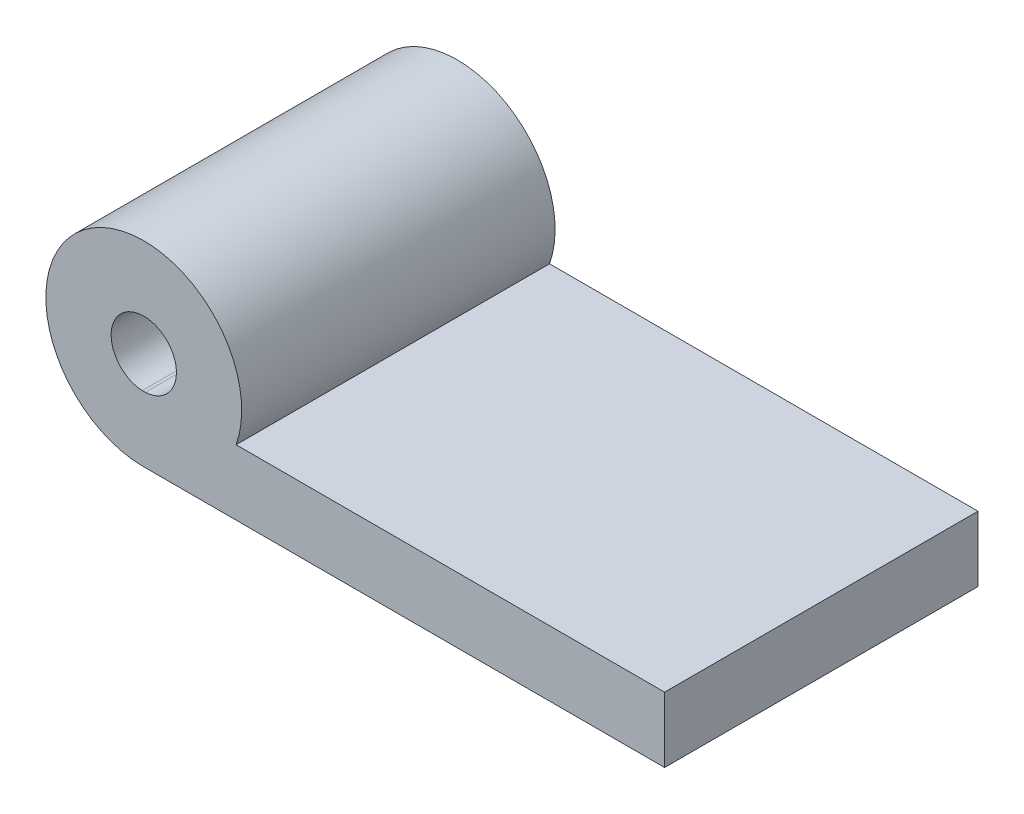
ISO-10303-21;
HEADER;
FILE_DESCRIPTION(('STEP AP214'),'2;1');
FILE_NAME('part.step','',(''),(''),'','','');
FILE_SCHEMA(('AUTOMOTIVE_DESIGN { 1 0 10303 214 1 1 1 1 }'));
ENDSEC;
DATA;
#1=APPLICATION_CONTEXT('core data for automotive mechanical design processes');
#2=APPLICATION_PROTOCOL_DEFINITION('international standard','automotive_design',2000,#1);
#3=PRODUCT_CONTEXT('',#1,'mechanical');
#4=PRODUCT('Part','Part','',(#3));
#5=PRODUCT_RELATED_PRODUCT_CATEGORY('part','',(#4));
#6=PRODUCT_DEFINITION_FORMATION('','',#4);
#7=PRODUCT_DEFINITION_CONTEXT('part definition',#1,'design');
#8=PRODUCT_DEFINITION('design','',#6,#7);
#9=PRODUCT_DEFINITION_SHAPE('','',#8);
#10=(LENGTH_UNIT() NAMED_UNIT(*) SI_UNIT(.MILLI.,.METRE.));
#11=(NAMED_UNIT(*) PLANE_ANGLE_UNIT() SI_UNIT($,.RADIAN.));
#12=(NAMED_UNIT(*) SI_UNIT($,.STERADIAN.) SOLID_ANGLE_UNIT());
#13=UNCERTAINTY_MEASURE_WITH_UNIT(LENGTH_MEASURE(1.E-05),#10,'distance_accuracy_value','');
#14=(GEOMETRIC_REPRESENTATION_CONTEXT(3) GLOBAL_UNCERTAINTY_ASSIGNED_CONTEXT((#13)) GLOBAL_UNIT_ASSIGNED_CONTEXT((#10,
#11,#12)) REPRESENTATION_CONTEXT('',''));
#15=CARTESIAN_POINT('',(0.,0.,0.));
#16=DIRECTION('',(0.,0.,1.));
#17=DIRECTION('',(1.,0.,0.));
#18=AXIS2_PLACEMENT_3D('',#15,#16,#17);
#19=CARTESIAN_POINT('',(-45.7439340400471,3.175,29.1247349823321));
#20=DIRECTION('',(0.,1.,0.));
#21=DIRECTION('',(0.,0.,1.));
#22=AXIS2_PLACEMENT_3D('',#19,#20,#21);
#23=PLANE('',#22);
#24=DIRECTION('',(1.,0.,0.));
#25=VECTOR('',#24,1.);
#26=CARTESIAN_POINT('',(-45.7439340400471,3.175,29.1247349823321));
#27=LINE('',#26,#25);
#28=CARTESIAN_POINT('',(-45.7439340400471,3.175,29.1247349823321));
#29=VERTEX_POINT('',#28);
#30=CARTESIAN_POINT('',(-45.5970142638255,3.175,29.1247349823321));
#31=VERTEX_POINT('',#30);
#32=EDGE_CURVE('E11',#29,#31,#27,.T.);
#33=ORIENTED_EDGE('',*,*,#32,.T.);
#34=DIRECTION('',(0.,0.,1.));
#35=VECTOR('',#34,1.);
#36=CARTESIAN_POINT('',(-45.5970142638255,3.175,13.8847349823321));
#37=LINE('',#36,#35);
#38=CARTESIAN_POINT('',(-45.5970142638255,3.175,13.8847349823321));
#39=VERTEX_POINT('',#38);
#40=EDGE_CURVE('E68',#31,#39,#37,.F.);
#41=ORIENTED_EDGE('',*,*,#40,.T.);
#42=DIRECTION('',(1.,0.,0.));
#43=VECTOR('',#42,1.);
#44=CARTESIAN_POINT('',(-45.7439340400471,3.175,13.8847349823321));
#45=LINE('',#44,#43);
#46=CARTESIAN_POINT('',(-45.7439340400471,3.175,13.8847349823321));
#47=VERTEX_POINT('',#46);
#48=EDGE_CURVE('E43',#39,#47,#45,.F.);
#49=ORIENTED_EDGE('',*,*,#48,.T.);
#50=DIRECTION('',(0.,0.,1.));
#51=VECTOR('',#50,1.);
#52=CARTESIAN_POINT('',(-45.7439340400471,3.175,13.8847349823321));
#53=LINE('',#52,#51);
#54=EDGE_CURVE('E127',#47,#29,#53,.T.);
#55=ORIENTED_EDGE('',*,*,#54,.T.);
#56=EDGE_LOOP('',(#33,#41,#49,#55));
#57=FACE_BOUND('',#56,.T.);
#58=ADVANCED_FACE('F33',(#57),#23,.T.);
#59=CARTESIAN_POINT('',(-45.7439340400471,3.175,29.1247349823321));
#60=DIRECTION('',(0.,0.,-1.));
#61=DIRECTION('',(-1.,0.,0.));
#62=AXIS2_PLACEMENT_3D('',#59,#60,#61);
#63=PLANE('',#62);
#64=CARTESIAN_POINT('',(-45.6704741519363,4.76079944975358,29.1247349823321));
#65=DIRECTION('',(0.,0.,1.));
#66=DIRECTION('',(1.,0.,0.));
#67=AXIS2_PLACEMENT_3D('',#64,#65,#66);
#68=CIRCLE('',#67,4.76136616486647);
#69=CARTESIAN_POINT('',(-41.1809476890344,3.175,29.1247349823321));
#70=VERTEX_POINT('',#69);
#71=CARTESIAN_POINT('',(-45.7439340400471,0.,29.1247349823321));
#72=VERTEX_POINT('',#71);
#73=EDGE_CURVE('E75',#70,#72,#68,.T.);
#74=ORIENTED_EDGE('',*,*,#73,.T.);
#75=CARTESIAN_POINT('',(-45.7439340400471,0.,29.1247349823321));
#76=DIRECTION('',(1.,0.,0.));
#77=VECTOR('',#76,1.);
#78=LINE('',#75,#77);
#79=CARTESIAN_POINT('',(-45.5970142638254,0.,29.1247349823321));
#80=VERTEX_POINT('',#79);
#81=EDGE_CURVE('E112',#72,#80,#78,.T.);
#82=ORIENTED_EDGE('',*,*,#81,.T.);
#83=DIRECTION('',(1.,0.,0.));
#84=VECTOR('',#83,1.);
#85=CARTESIAN_POINT('',(-45.7439340400471,0.,29.1247349823321));
#86=LINE('',#85,#84);
#87=CARTESIAN_POINT('',(-20.3439340400471,0.,29.1247349823321));
#88=VERTEX_POINT('',#87);
#89=EDGE_CURVE('E162',#80,#88,#86,.T.);
#90=ORIENTED_EDGE('',*,*,#89,.T.);
#91=DIRECTION('',(0.,-1.,0.));
#92=VECTOR('',#91,1.);
#93=CARTESIAN_POINT('',(-20.3439340400471,3.175,29.1247349823321));
#94=LINE('',#93,#92);
#95=CARTESIAN_POINT('',(-20.3439340400471,3.175,29.1247349823321));
#96=VERTEX_POINT('',#95);
#97=EDGE_CURVE('E107',#96,#88,#94,.T.);
#98=ORIENTED_EDGE('',*,*,#97,.F.);
#99=DIRECTION('',(1.,0.,0.));
#100=VECTOR('',#99,1.);
#101=CARTESIAN_POINT('',(-45.7439340400471,3.175,29.1247349823321));
#102=LINE('',#101,#100);
#103=EDGE_CURVE('E130',#70,#96,#102,.T.);
#104=ORIENTED_EDGE('',*,*,#103,.F.);
#105=EDGE_LOOP('',(#74,#82,#90,#98,#104));
#106=FACE_BOUND('',#105,.T.);
#107=ORIENTED_EDGE('',*,*,#32,.F.);
#108=CARTESIAN_POINT('',(-45.6704741519363,4.76079944975358,29.1247349823321));
#109=DIRECTION('',(0.,0.,1.));
#110=DIRECTION('',(1.,0.,0.));
#111=AXIS2_PLACEMENT_3D('',#108,#109,#110);
#112=CIRCLE('',#111,1.5875);
#113=EDGE_CURVE('E64',#31,#29,#112,.T.);
#114=ORIENTED_EDGE('',*,*,#113,.F.);
#115=EDGE_LOOP('',(#107,#114));
#116=FACE_BOUND('',#115,.T.);
#117=ADVANCED_FACE('F35',(#106,#116),#63,.F.);
#118=CARTESIAN_POINT('',(-20.3439340400471,3.175,13.8847349823321));
#119=DIRECTION('',(-1.,0.,0.));
#120=DIRECTION('',(0.,0.,1.));
#121=AXIS2_PLACEMENT_3D('',#118,#119,#120);
#122=PLANE('',#121);
#123=DIRECTION('',(0.,0.,-1.));
#124=VECTOR('',#123,1.);
#125=CARTESIAN_POINT('',(-20.3439340400471,0.,13.8847349823321));
#126=LINE('',#125,#124);
#127=CARTESIAN_POINT('',(-20.3439340400471,0.,13.8847349823321));
#128=VERTEX_POINT('',#127);
#129=EDGE_CURVE('E100',#88,#128,#126,.T.);
#130=ORIENTED_EDGE('',*,*,#129,.T.);
#131=DIRECTION('',(0.,-1.,0.));
#132=VECTOR('',#131,1.);
#133=CARTESIAN_POINT('',(-20.3439340400471,3.175,13.8847349823321));
#134=LINE('',#133,#132);
#135=CARTESIAN_POINT('',(-20.3439340400471,3.175,13.8847349823321));
#136=VERTEX_POINT('',#135);
#137=EDGE_CURVE('E104',#136,#128,#134,.T.);
#138=ORIENTED_EDGE('',*,*,#137,.F.);
#139=DIRECTION('',(0.,0.,-1.));
#140=VECTOR('',#139,1.);
#141=CARTESIAN_POINT('',(-20.3439340400471,3.175,13.8847349823321));
#142=LINE('',#141,#140);
#143=EDGE_CURVE('E152',#96,#136,#142,.T.);
#144=ORIENTED_EDGE('',*,*,#143,.F.);
#145=ORIENTED_EDGE('',*,*,#97,.T.);
#146=EDGE_LOOP('',(#130,#138,#144,#145));
#147=FACE_BOUND('',#146,.T.);
#148=ADVANCED_FACE('F102',(#147),#122,.F.);
#149=CARTESIAN_POINT('',(-45.7439340400471,3.175,13.8847349823321));
#150=DIRECTION('',(0.,0.,1.));
#151=DIRECTION('',(1.,0.,0.));
#152=AXIS2_PLACEMENT_3D('',#149,#150,#151);
#153=PLANE('',#152);
#154=CARTESIAN_POINT('',(-45.5970142638254,0.,13.8847349823321));
#155=DIRECTION('',(-1.,0.,0.));
#156=VECTOR('',#155,1.);
#157=LINE('',#154,#156);
#158=CARTESIAN_POINT('',(-45.5970142638254,0.,13.8847349823321));
#159=VERTEX_POINT('',#158);
#160=CARTESIAN_POINT('',(-45.7439340400471,0.,13.8847349823321));
#161=VERTEX_POINT('',#160);
#162=EDGE_CURVE('E111',#159,#161,#157,.T.);
#163=ORIENTED_EDGE('',*,*,#162,.T.);
#164=CARTESIAN_POINT('',(-45.6704741519363,4.76079944975358,13.8847349823321));
#165=DIRECTION('',(0.,0.,1.));
#166=DIRECTION('',(1.,0.,0.));
#167=AXIS2_PLACEMENT_3D('',#164,#165,#166);
#168=CIRCLE('',#167,4.76136616486647);
#169=CARTESIAN_POINT('',(-41.1809476890344,3.175,13.8847349823321));
#170=VERTEX_POINT('',#169);
#171=EDGE_CURVE('E166',#170,#161,#168,.T.);
#172=ORIENTED_EDGE('',*,*,#171,.F.);
#173=DIRECTION('',(-1.,0.,0.));
#174=VECTOR('',#173,1.);
#175=CARTESIAN_POINT('',(-45.7439340400471,3.175,13.8847349823321));
#176=LINE('',#175,#174);
#177=EDGE_CURVE('E122',#136,#170,#176,.T.);
#178=ORIENTED_EDGE('',*,*,#177,.F.);
#179=ORIENTED_EDGE('',*,*,#137,.T.);
#180=DIRECTION('',(-1.,0.,0.));
#181=VECTOR('',#180,1.);
#182=CARTESIAN_POINT('',(-45.7439340400471,0.,13.8847349823321));
#183=LINE('',#182,#181);
#184=EDGE_CURVE('E119',#128,#159,#183,.T.);
#185=ORIENTED_EDGE('',*,*,#184,.T.);
#186=EDGE_LOOP('',(#163,#172,#178,#179,#185));
#187=FACE_BOUND('',#186,.T.);
#188=CARTESIAN_POINT('',(-45.6704741519363,4.76079944975358,13.8847349823321));
#189=DIRECTION('',(0.,0.,1.));
#190=DIRECTION('',(1.,0.,0.));
#191=AXIS2_PLACEMENT_3D('',#188,#189,#190);
#192=CIRCLE('',#191,1.5875);
#193=EDGE_CURVE('E51',#39,#47,#192,.T.);
#194=ORIENTED_EDGE('',*,*,#193,.T.);
#195=ORIENTED_EDGE('',*,*,#48,.F.);
#196=EDGE_LOOP('',(#194,#195));
#197=FACE_BOUND('',#196,.T.);
#198=ADVANCED_FACE('F117',(#187,#197),#153,.F.);
#199=DIRECTION('',(0.,0.,1.));
#200=VECTOR('',#199,1.);
#201=CARTESIAN_POINT('',(-41.1809476890344,3.175,13.8847349823321));
#202=LINE('',#201,#200);
#203=EDGE_CURVE('E164',#70,#170,#202,.F.);
#204=ORIENTED_EDGE('',*,*,#203,.F.);
#205=ORIENTED_EDGE('',*,*,#103,.T.);
#206=ORIENTED_EDGE('',*,*,#143,.T.);
#207=ORIENTED_EDGE('',*,*,#177,.T.);
#208=EDGE_LOOP('',(#204,#205,#206,#207));
#209=FACE_BOUND('',#208,.T.);
#210=ADVANCED_FACE('F183',(#209),#23,.T.);
#211=CARTESIAN_POINT('',(-45.7439340400471,0.,29.1247349823321));
#212=DIRECTION('',(0.,1.,0.));
#213=DIRECTION('',(0.,0.,1.));
#214=AXIS2_PLACEMENT_3D('',#211,#212,#213);
#215=PLANE('',#214);
#216=ORIENTED_EDGE('',*,*,#89,.F.);
#217=DIRECTION('',(0.,0.,1.));
#218=VECTOR('',#217,1.);
#219=CARTESIAN_POINT('',(-45.5970142638254,0.,13.8847349823321));
#220=LINE('',#219,#218);
#221=EDGE_CURVE('E126',#80,#159,#220,.F.);
#222=ORIENTED_EDGE('',*,*,#221,.T.);
#223=ORIENTED_EDGE('',*,*,#184,.F.);
#224=ORIENTED_EDGE('',*,*,#129,.F.);
#225=EDGE_LOOP('',(#216,#222,#223,#224));
#226=FACE_BOUND('',#225,.T.);
#227=ADVANCED_FACE('F125',(#226),#215,.F.);
#228=CARTESIAN_POINT('',(-45.6704741519363,4.76079944975358,13.8847349823321));
#229=DIRECTION('',(0.,0.,1.));
#230=DIRECTION('',(1.,0.,0.));
#231=AXIS2_PLACEMENT_3D('',#228,#229,#230);
#232=CYLINDRICAL_SURFACE('',#231,4.76136616486647);
#233=ORIENTED_EDGE('',*,*,#81,.F.);
#234=ORIENTED_EDGE('',*,*,#73,.F.);
#235=ORIENTED_EDGE('',*,*,#203,.T.);
#236=ORIENTED_EDGE('',*,*,#171,.T.);
#237=ORIENTED_EDGE('',*,*,#162,.F.);
#238=ORIENTED_EDGE('',*,*,#221,.F.);
#239=EDGE_LOOP('',(#233,#234,#235,#236,#237,#238));
#240=FACE_BOUND('',#239,.T.);
#241=ADVANCED_FACE('F168',(#240),#232,.T.);
#242=CARTESIAN_POINT('',(-45.6704741519363,4.76079944975358,13.8847349823321));
#243=DIRECTION('',(0.,0.,1.));
#244=DIRECTION('',(1.,0.,0.));
#245=AXIS2_PLACEMENT_3D('',#242,#243,#244);
#246=CYLINDRICAL_SURFACE('',#245,1.5875);
#247=ORIENTED_EDGE('',*,*,#54,.F.);
#248=ORIENTED_EDGE('',*,*,#193,.F.);
#249=ORIENTED_EDGE('',*,*,#40,.F.);
#250=ORIENTED_EDGE('',*,*,#113,.T.);
#251=EDGE_LOOP('',(#247,#248,#249,#250));
#252=FACE_BOUND('',#251,.T.);
#253=ADVANCED_FACE('F195',(#252),#246,.F.);
#254=CLOSED_SHELL('',(#58,#117,#148,#198,#210,#227,#241,#253));
#255=MANIFOLD_SOLID_BREP('B2',#254);
#256=ADVANCED_BREP_SHAPE_REPRESENTATION('',(#18,#255),#14);
#257=SHAPE_DEFINITION_REPRESENTATION(#9,#256);
ENDSEC;
END-ISO-10303-21;
